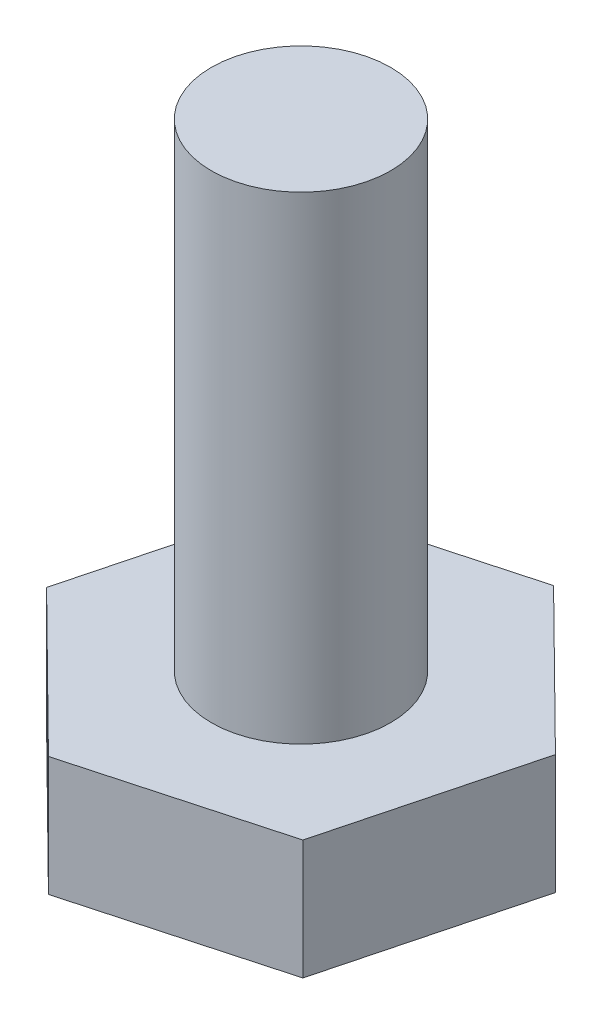
ISO-10303-21;
HEADER;
FILE_DESCRIPTION(('STEP AP214'),'2;1');
FILE_NAME('part.step','',(''),(''),'','','');
FILE_SCHEMA(('AUTOMOTIVE_DESIGN { 1 0 10303 214 1 1 1 1 }'));
ENDSEC;
DATA;
#1=APPLICATION_CONTEXT('core data for automotive mechanical design processes');
#2=APPLICATION_PROTOCOL_DEFINITION('international standard','automotive_design',2000,#1);
#3=PRODUCT_CONTEXT('',#1,'mechanical');
#4=PRODUCT('Part','Part','',(#3));
#5=PRODUCT_RELATED_PRODUCT_CATEGORY('part','',(#4));
#6=PRODUCT_DEFINITION_FORMATION('','',#4);
#7=PRODUCT_DEFINITION_CONTEXT('part definition',#1,'design');
#8=PRODUCT_DEFINITION('design','',#6,#7);
#9=PRODUCT_DEFINITION_SHAPE('','',#8);
#10=(LENGTH_UNIT() NAMED_UNIT(*) SI_UNIT(.MILLI.,.METRE.));
#11=(NAMED_UNIT(*) PLANE_ANGLE_UNIT() SI_UNIT($,.RADIAN.));
#12=(NAMED_UNIT(*) SI_UNIT($,.STERADIAN.) SOLID_ANGLE_UNIT());
#13=UNCERTAINTY_MEASURE_WITH_UNIT(LENGTH_MEASURE(1.E-05),#10,'distance_accuracy_value','');
#14=(GEOMETRIC_REPRESENTATION_CONTEXT(3) GLOBAL_UNCERTAINTY_ASSIGNED_CONTEXT((#13)) GLOBAL_UNIT_ASSIGNED_CONTEXT((#10,
#11,#12)) REPRESENTATION_CONTEXT('',''));
#15=CARTESIAN_POINT('',(0.,0.,0.));
#16=DIRECTION('',(0.,0.,1.));
#17=DIRECTION('',(1.,0.,0.));
#18=AXIS2_PLACEMENT_3D('',#15,#16,#17);
#19=CARTESIAN_POINT('',(-0.875028005436949,2.,3.35176460833709));
#20=DIRECTION('',(-0.265028548361683,0.,-0.964240565706141));
#21=DIRECTION('',(-0.964240565706141,0.,0.265028548361683));
#22=AXIS2_PLACEMENT_3D('',#19,#20,#21);
#23=PLANE('',#22);
#24=DIRECTION('',(0.964240565706141,0.,-0.265028548361683));
#25=VECTOR('',#24,1.);
#26=CARTESIAN_POINT('',(-0.875028005436949,0.,3.35176460833709));
#27=LINE('',#26,#25);
#28=CARTESIAN_POINT('',(-0.875028005436949,0.,3.35176460833709));
#29=VERTEX_POINT('',#28);
#30=CARTESIAN_POINT('',(2.46519929560704,0.,2.43367878589977));
#31=VERTEX_POINT('',#30);
#32=EDGE_CURVE('E117',#29,#31,#27,.T.);
#33=ORIENTED_EDGE('',*,*,#32,.T.);
#34=DIRECTION('',(0.,-1.,0.));
#35=VECTOR('',#34,1.);
#36=CARTESIAN_POINT('',(2.46519929560704,2.,2.43367878589977));
#37=LINE('',#36,#35);
#38=CARTESIAN_POINT('',(2.46519929560704,2.,2.43367878589977));
#39=VERTEX_POINT('',#38);
#40=EDGE_CURVE('E11',#39,#31,#37,.T.);
#41=ORIENTED_EDGE('',*,*,#40,.F.);
#42=DIRECTION('',(0.964240565706141,0.,-0.265028548361683));
#43=VECTOR('',#42,1.);
#44=CARTESIAN_POINT('',(-0.875028005436949,2.,3.35176460833709));
#45=LINE('',#44,#43);
#46=CARTESIAN_POINT('',(-0.875028005436949,2.,3.35176460833709));
#47=VERTEX_POINT('',#46);
#48=EDGE_CURVE('E128',#47,#39,#45,.T.);
#49=ORIENTED_EDGE('',*,*,#48,.F.);
#50=DIRECTION('',(0.,-1.,0.));
#51=VECTOR('',#50,1.);
#52=CARTESIAN_POINT('',(-0.875028005436949,2.,3.35176460833709));
#53=LINE('',#52,#51);
#54=EDGE_CURVE('E113',#47,#29,#53,.T.);
#55=ORIENTED_EDGE('',*,*,#54,.T.);
#56=EDGE_LOOP('',(#33,#41,#49,#55));
#57=FACE_BOUND('',#56,.T.);
#58=ADVANCED_FACE('F33',(#57),#23,.F.);
#59=CARTESIAN_POINT('',(2.46519929560704,2.,2.43367878589977));
#60=DIRECTION('',(-0.967571099441838,0.,-0.252598827243741));
#61=DIRECTION('',(-0.252598827243742,0.,0.967571099441838));
#62=AXIS2_PLACEMENT_3D('',#59,#60,#61);
#63=PLANE('',#62);
#64=DIRECTION('',(0.252598827243741,0.,-0.967571099441838));
#65=VECTOR('',#64,1.);
#66=CARTESIAN_POINT('',(2.46519929560704,0.,2.43367878589977));
#67=LINE('',#66,#65);
#68=CARTESIAN_POINT('',(3.34022730104399,0.,-0.918085822437318));
#69=VERTEX_POINT('',#68);
#70=EDGE_CURVE('E120',#31,#69,#67,.T.);
#71=ORIENTED_EDGE('',*,*,#70,.T.);
#72=DIRECTION('',(0.,-1.,0.));
#73=VECTOR('',#72,1.);
#74=CARTESIAN_POINT('',(3.34022730104399,2.,-0.918085822437318));
#75=LINE('',#74,#73);
#76=CARTESIAN_POINT('',(3.34022730104399,2.,-0.918085822437318));
#77=VERTEX_POINT('',#76);
#78=EDGE_CURVE('E41',#77,#69,#75,.T.);
#79=ORIENTED_EDGE('',*,*,#78,.F.);
#80=DIRECTION('',(0.252598827243741,0.,-0.967571099441838));
#81=VECTOR('',#80,1.);
#82=CARTESIAN_POINT('',(2.46519929560704,2.,2.43367878589977));
#83=LINE('',#82,#81);
#84=EDGE_CURVE('E86',#39,#77,#83,.T.);
#85=ORIENTED_EDGE('',*,*,#84,.F.);
#86=ORIENTED_EDGE('',*,*,#40,.T.);
#87=EDGE_LOOP('',(#71,#79,#85,#86));
#88=FACE_BOUND('',#87,.T.);
#89=ADVANCED_FACE('F153',(#88),#63,.F.);
#90=CARTESIAN_POINT('',(3.34022730104399,2.,-0.918085822437318));
#91=DIRECTION('',(-0.702542551080157,0.,0.711641738462399));
#92=DIRECTION('',(0.711641738462399,0.,0.702542551080157));
#93=AXIS2_PLACEMENT_3D('',#90,#91,#92);
#94=PLANE('',#93);
#95=DIRECTION('',(-0.711641738462399,0.,-0.702542551080157));
#96=VECTOR('',#95,1.);
#97=CARTESIAN_POINT('',(3.34022730104399,0.,-0.918085822437318));
#98=LINE('',#97,#96);
#99=CARTESIAN_POINT('',(0.875028005436953,0.,-3.35176460833709));
#100=VERTEX_POINT('',#99);
#101=EDGE_CURVE('E123',#69,#100,#98,.T.);
#102=ORIENTED_EDGE('',*,*,#101,.T.);
#103=DIRECTION('',(0.,-1.,0.));
#104=VECTOR('',#103,1.);
#105=CARTESIAN_POINT('',(0.875028005436953,2.,-3.35176460833709));
#106=LINE('',#105,#104);
#107=CARTESIAN_POINT('',(0.875028005436953,2.,-3.35176460833709));
#108=VERTEX_POINT('',#107);
#109=EDGE_CURVE('E108',#108,#100,#106,.T.);
#110=ORIENTED_EDGE('',*,*,#109,.F.);
#111=DIRECTION('',(-0.711641738462399,0.,-0.702542551080157));
#112=VECTOR('',#111,1.);
#113=CARTESIAN_POINT('',(3.34022730104399,2.,-0.918085822437318));
#114=LINE('',#113,#112);
#115=EDGE_CURVE('E99',#77,#108,#114,.T.);
#116=ORIENTED_EDGE('',*,*,#115,.F.);
#117=ORIENTED_EDGE('',*,*,#78,.T.);
#118=EDGE_LOOP('',(#102,#110,#116,#117));
#119=FACE_BOUND('',#118,.T.);
#120=ADVANCED_FACE('F134',(#119),#94,.F.);
#121=CARTESIAN_POINT('',(0.875028005436953,2.,-3.35176460833709));
#122=DIRECTION('',(0.265028548361682,0.,0.964240565706141));
#123=DIRECTION('',(0.964240565706141,0.,-0.265028548361682));
#124=AXIS2_PLACEMENT_3D('',#121,#122,#123);
#125=PLANE('',#124);
#126=DIRECTION('',(-0.964240565706141,0.,0.265028548361682));
#127=VECTOR('',#126,1.);
#128=CARTESIAN_POINT('',(0.875028005436953,0.,-3.35176460833709));
#129=LINE('',#128,#127);
#130=CARTESIAN_POINT('',(-2.46519929560704,0.,-2.43367878589978));
#131=VERTEX_POINT('',#130);
#132=EDGE_CURVE('E107',#100,#131,#129,.T.);
#133=ORIENTED_EDGE('',*,*,#132,.T.);
#134=DIRECTION('',(0.,-1.,0.));
#135=VECTOR('',#134,1.);
#136=CARTESIAN_POINT('',(-2.46519929560704,2.,-2.43367878589978));
#137=LINE('',#136,#135);
#138=CARTESIAN_POINT('',(-2.46519929560704,2.,-2.43367878589978));
#139=VERTEX_POINT('',#138);
#140=EDGE_CURVE('E104',#139,#131,#137,.T.);
#141=ORIENTED_EDGE('',*,*,#140,.F.);
#142=DIRECTION('',(-0.964240565706141,0.,0.265028548361682));
#143=VECTOR('',#142,1.);
#144=CARTESIAN_POINT('',(0.875028005436953,2.,-3.35176460833709));
#145=LINE('',#144,#143);
#146=EDGE_CURVE('E93',#108,#139,#145,.T.);
#147=ORIENTED_EDGE('',*,*,#146,.F.);
#148=ORIENTED_EDGE('',*,*,#109,.T.);
#149=EDGE_LOOP('',(#133,#141,#147,#148));
#150=FACE_BOUND('',#149,.T.);
#151=ADVANCED_FACE('F105',(#150),#125,.F.);
#152=CARTESIAN_POINT('',(-2.46519929560704,2.,-2.43367878589978));
#153=DIRECTION('',(0.967571099441838,0.,0.252598827243741));
#154=DIRECTION('',(0.252598827243742,0.,-0.967571099441838));
#155=AXIS2_PLACEMENT_3D('',#152,#153,#154);
#156=PLANE('',#155);
#157=DIRECTION('',(-0.252598827243741,0.,0.967571099441838));
#158=VECTOR('',#157,1.);
#159=CARTESIAN_POINT('',(-2.46519929560704,0.,-2.43367878589978));
#160=LINE('',#159,#158);
#161=CARTESIAN_POINT('',(-3.34022730104399,0.,0.91808582243732));
#162=VERTEX_POINT('',#161);
#163=EDGE_CURVE('E72',#131,#162,#160,.T.);
#164=ORIENTED_EDGE('',*,*,#163,.T.);
#165=DIRECTION('',(0.,-1.,0.));
#166=VECTOR('',#165,1.);
#167=CARTESIAN_POINT('',(-3.34022730104399,2.,0.91808582243732));
#168=LINE('',#167,#166);
#169=CARTESIAN_POINT('',(-3.34022730104399,2.,0.91808582243732));
#170=VERTEX_POINT('',#169);
#171=EDGE_CURVE('E109',#170,#162,#168,.T.);
#172=ORIENTED_EDGE('',*,*,#171,.F.);
#173=DIRECTION('',(-0.252598827243741,0.,0.967571099441838));
#174=VECTOR('',#173,1.);
#175=CARTESIAN_POINT('',(-2.46519929560704,2.,-2.43367878589978));
#176=LINE('',#175,#174);
#177=EDGE_CURVE('E97',#139,#170,#176,.T.);
#178=ORIENTED_EDGE('',*,*,#177,.F.);
#179=ORIENTED_EDGE('',*,*,#140,.T.);
#180=EDGE_LOOP('',(#164,#172,#178,#179));
#181=FACE_BOUND('',#180,.T.);
#182=ADVANCED_FACE('F111',(#181),#156,.F.);
#183=CARTESIAN_POINT('',(-3.34022730104399,2.,0.91808582243732));
#184=DIRECTION('',(0.702542551080156,0.,-0.7116417384624));
#185=DIRECTION('',(-0.7116417384624,0.,-0.702542551080156));
#186=AXIS2_PLACEMENT_3D('',#183,#184,#185);
#187=PLANE('',#186);
#188=DIRECTION('',(0.7116417384624,0.,0.702542551080156));
#189=VECTOR('',#188,1.);
#190=CARTESIAN_POINT('',(-3.34022730104399,0.,0.91808582243732));
#191=LINE('',#190,#189);
#192=EDGE_CURVE('E78',#162,#29,#191,.T.);
#193=ORIENTED_EDGE('',*,*,#192,.T.);
#194=ORIENTED_EDGE('',*,*,#54,.F.);
#195=DIRECTION('',(0.7116417384624,0.,0.702542551080156));
#196=VECTOR('',#195,1.);
#197=CARTESIAN_POINT('',(-3.34022730104399,2.,0.91808582243732));
#198=LINE('',#197,#196);
#199=EDGE_CURVE('E49',#170,#47,#198,.T.);
#200=ORIENTED_EDGE('',*,*,#199,.F.);
#201=ORIENTED_EDGE('',*,*,#171,.T.);
#202=EDGE_LOOP('',(#193,#194,#200,#201));
#203=FACE_BOUND('',#202,.T.);
#204=ADVANCED_FACE('F141',(#203),#187,.F.);
#205=CARTESIAN_POINT('',(0.,2.,0.));
#206=DIRECTION('',(0.,1.,0.));
#207=DIRECTION('',(0.,0.,1.));
#208=AXIS2_PLACEMENT_3D('',#205,#206,#207);
#209=PLANE('',#208);
#210=CARTESIAN_POINT('',(0.,2.,0.));
#211=DIRECTION('',(0.,1.,0.));
#212=DIRECTION('',(0.,0.,1.));
#213=AXIS2_PLACEMENT_3D('',#210,#211,#212);
#214=CIRCLE('',#213,1.5);
#215=CARTESIAN_POINT('',(0.,2.,1.5));
#216=VERTEX_POINT('',#215);
#217=EDGE_CURVE('E214',#216,#216,#214,.T.);
#218=ORIENTED_EDGE('',*,*,#217,.F.);
#219=EDGE_LOOP('',(#218));
#220=FACE_BOUND('',#219,.T.);
#221=ORIENTED_EDGE('',*,*,#48,.T.);
#222=ORIENTED_EDGE('',*,*,#84,.T.);
#223=ORIENTED_EDGE('',*,*,#115,.T.);
#224=ORIENTED_EDGE('',*,*,#146,.T.);
#225=ORIENTED_EDGE('',*,*,#177,.T.);
#226=ORIENTED_EDGE('',*,*,#199,.T.);
#227=EDGE_LOOP('',(#221,#222,#223,#224,#225,#226));
#228=FACE_BOUND('',#227,.T.);
#229=ADVANCED_FACE('F95',(#220,#228),#209,.T.);
#230=CARTESIAN_POINT('',(0.,0.,0.));
#231=DIRECTION('',(0.,1.,0.));
#232=DIRECTION('',(0.,0.,1.));
#233=AXIS2_PLACEMENT_3D('',#230,#231,#232);
#234=PLANE('',#233);
#235=ORIENTED_EDGE('',*,*,#32,.F.);
#236=ORIENTED_EDGE('',*,*,#192,.F.);
#237=ORIENTED_EDGE('',*,*,#163,.F.);
#238=ORIENTED_EDGE('',*,*,#132,.F.);
#239=ORIENTED_EDGE('',*,*,#101,.F.);
#240=ORIENTED_EDGE('',*,*,#70,.F.);
#241=EDGE_LOOP('',(#235,#236,#237,#238,#239,#240));
#242=FACE_BOUND('',#241,.T.);
#243=ADVANCED_FACE('F137',(#242),#234,.F.);
#244=CARTESIAN_POINT('',(0.,10.,0.));
#245=DIRECTION('',(0.,-1.,0.));
#246=DIRECTION('',(0.,0.,-1.));
#247=AXIS2_PLACEMENT_3D('',#244,#245,#246);
#248=CYLINDRICAL_SURFACE('',#247,1.5);
#249=CARTESIAN_POINT('',(0.,10.,0.));
#250=DIRECTION('',(0.,1.,0.));
#251=DIRECTION('',(0.,0.,1.));
#252=AXIS2_PLACEMENT_3D('',#249,#250,#251);
#253=CIRCLE('',#252,1.5);
#254=CARTESIAN_POINT('',(0.,10.,1.5));
#255=VERTEX_POINT('',#254);
#256=EDGE_CURVE('E121',#255,#255,#253,.T.);
#257=ORIENTED_EDGE('',*,*,#256,.F.);
#258=EDGE_LOOP('',(#257));
#259=FACE_BOUND('',#258,.T.);
#260=ORIENTED_EDGE('',*,*,#217,.T.);
#261=EDGE_LOOP('',(#260));
#262=FACE_BOUND('',#261,.T.);
#263=ADVANCED_FACE('F185',(#259,#262),#248,.T.);
#264=CARTESIAN_POINT('',(0.,10.,0.));
#265=DIRECTION('',(0.,1.,0.));
#266=DIRECTION('',(0.,0.,1.));
#267=AXIS2_PLACEMENT_3D('',#264,#265,#266);
#268=PLANE('',#267);
#269=ORIENTED_EDGE('',*,*,#256,.T.);
#270=EDGE_LOOP('',(#269));
#271=FACE_BOUND('',#270,.T.);
#272=ADVANCED_FACE('F198',(#271),#268,.T.);
#273=CLOSED_SHELL('',(#58,#89,#120,#151,#182,#204,#229,#243,#263,#272));
#274=MANIFOLD_SOLID_BREP('B2',#273);
#275=ADVANCED_BREP_SHAPE_REPRESENTATION('',(#18,#274),#14);
#276=SHAPE_DEFINITION_REPRESENTATION(#9,#275);
ENDSEC;
END-ISO-10303-21;
